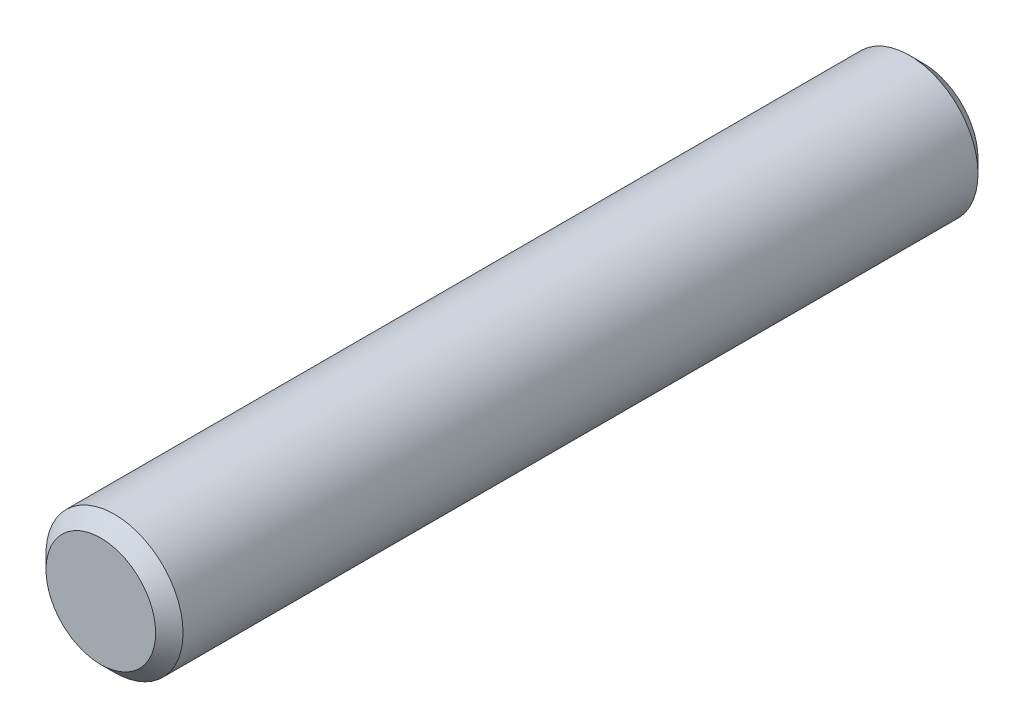
ISO-10303-21;
HEADER;
FILE_DESCRIPTION(('STEP AP214'),'2;1');
FILE_NAME('part.step','',(''),(''),'','','');
FILE_SCHEMA(('AUTOMOTIVE_DESIGN { 1 0 10303 214 1 1 1 1 }'));
ENDSEC;
DATA;
#1=APPLICATION_CONTEXT('core data for automotive mechanical design processes');
#2=APPLICATION_PROTOCOL_DEFINITION('international standard','automotive_design',2000,#1);
#3=PRODUCT_CONTEXT('',#1,'mechanical');
#4=PRODUCT('Part','Part','',(#3));
#5=PRODUCT_RELATED_PRODUCT_CATEGORY('part','',(#4));
#6=PRODUCT_DEFINITION_FORMATION('','',#4);
#7=PRODUCT_DEFINITION_CONTEXT('part definition',#1,'design');
#8=PRODUCT_DEFINITION('design','',#6,#7);
#9=PRODUCT_DEFINITION_SHAPE('','',#8);
#10=(LENGTH_UNIT() NAMED_UNIT(*) SI_UNIT(.MILLI.,.METRE.));
#11=(NAMED_UNIT(*) PLANE_ANGLE_UNIT() SI_UNIT($,.RADIAN.));
#12=(NAMED_UNIT(*) SI_UNIT($,.STERADIAN.) SOLID_ANGLE_UNIT());
#13=UNCERTAINTY_MEASURE_WITH_UNIT(LENGTH_MEASURE(1.E-05),#10,'distance_accuracy_value','');
#14=(GEOMETRIC_REPRESENTATION_CONTEXT(3) GLOBAL_UNCERTAINTY_ASSIGNED_CONTEXT((#13)) GLOBAL_UNIT_ASSIGNED_CONTEXT((#10,
#11,#12)) REPRESENTATION_CONTEXT('',''));
#15=CARTESIAN_POINT('',(0.,0.,0.));
#16=DIRECTION('',(0.,0.,1.));
#17=DIRECTION('',(1.,0.,0.));
#18=AXIS2_PLACEMENT_3D('',#15,#16,#17);
#19=CARTESIAN_POINT('',(0.,0.,15.));
#20=DIRECTION('',(0.,0.,-1.));
#21=DIRECTION('',(-1.,0.,0.));
#22=AXIS2_PLACEMENT_3D('',#19,#20,#21);
#23=CYLINDRICAL_SURFACE('',#22,2.5);
#24=CARTESIAN_POINT('',(0.,0.,-14.5));
#25=DIRECTION('',(0.,0.,1.));
#26=DIRECTION('',(1.,0.,0.));
#27=AXIS2_PLACEMENT_3D('',#24,#25,#26);
#28=CIRCLE('',#27,2.5);
#29=CARTESIAN_POINT('',(2.5,0.,-14.5));
#30=VERTEX_POINT('',#29);
#31=EDGE_CURVE('E45',#30,#30,#28,.T.);
#32=ORIENTED_EDGE('',*,*,#31,.T.);
#33=EDGE_LOOP('',(#32));
#34=FACE_BOUND('',#33,.T.);
#35=CARTESIAN_POINT('',(0.,0.,14.5));
#36=DIRECTION('',(0.,0.,1.));
#37=DIRECTION('',(1.,0.,0.));
#38=AXIS2_PLACEMENT_3D('',#35,#36,#37);
#39=CIRCLE('',#38,2.5);
#40=CARTESIAN_POINT('',(2.5,0.,14.5));
#41=VERTEX_POINT('',#40);
#42=EDGE_CURVE('E49',#41,#41,#39,.F.);
#43=ORIENTED_EDGE('',*,*,#42,.T.);
#44=EDGE_LOOP('',(#43));
#45=FACE_BOUND('',#44,.T.);
#46=ADVANCED_FACE('F34',(#34,#45),#23,.T.);
#47=CARTESIAN_POINT('',(0.,0.,15.));
#48=DIRECTION('',(0.,0.,1.));
#49=DIRECTION('',(1.,0.,0.));
#50=AXIS2_PLACEMENT_3D('',#47,#48,#49);
#51=PLANE('',#50);
#52=CARTESIAN_POINT('',(0.,0.,15.));
#53=DIRECTION('',(0.,0.,1.));
#54=DIRECTION('',(1.,0.,0.));
#55=AXIS2_PLACEMENT_3D('',#52,#53,#54);
#56=CIRCLE('',#55,2.);
#57=CARTESIAN_POINT('',(2.,0.,15.));
#58=VERTEX_POINT('',#57);
#59=EDGE_CURVE('E10',#58,#58,#56,.T.);
#60=ORIENTED_EDGE('',*,*,#59,.T.);
#61=EDGE_LOOP('',(#60));
#62=FACE_BOUND('',#61,.T.);
#63=ADVANCED_FACE('F65',(#62),#51,.T.);
#64=CARTESIAN_POINT('',(0.,0.,-15.));
#65=DIRECTION('',(0.,0.,1.));
#66=DIRECTION('',(1.,0.,0.));
#67=AXIS2_PLACEMENT_3D('',#64,#65,#66);
#68=PLANE('',#67);
#69=CARTESIAN_POINT('',(0.,0.,-15.));
#70=DIRECTION('',(0.,0.,1.));
#71=DIRECTION('',(1.,0.,0.));
#72=AXIS2_PLACEMENT_3D('',#69,#70,#71);
#73=CIRCLE('',#72,2.);
#74=CARTESIAN_POINT('',(2.,0.,-15.));
#75=VERTEX_POINT('',#74);
#76=EDGE_CURVE('E41',#75,#75,#73,.F.);
#77=ORIENTED_EDGE('',*,*,#76,.T.);
#78=EDGE_LOOP('',(#77));
#79=FACE_BOUND('',#78,.T.);
#80=ADVANCED_FACE('F62',(#79),#68,.F.);
#81=CARTESIAN_POINT('',(0.,0.,-14.5));
#82=DIRECTION('',(0.,0.,1.));
#83=DIRECTION('',(1.,0.,0.));
#84=AXIS2_PLACEMENT_3D('',#81,#82,#83);
#85=CONICAL_SURFACE('',#84,2.5,0.785398163397446);
#86=ORIENTED_EDGE('',*,*,#76,.F.);
#87=EDGE_LOOP('',(#86));
#88=FACE_BOUND('',#87,.T.);
#89=ORIENTED_EDGE('',*,*,#31,.F.);
#90=EDGE_LOOP('',(#89));
#91=FACE_BOUND('',#90,.T.);
#92=ADVANCED_FACE('F58',(#88,#91),#85,.T.);
#93=CARTESIAN_POINT('',(0.,0.,15.));
#94=DIRECTION('',(0.,0.,-1.));
#95=DIRECTION('',(-1.,0.,0.));
#96=AXIS2_PLACEMENT_3D('',#93,#94,#95);
#97=CONICAL_SURFACE('',#96,2.,0.785398163397443);
#98=ORIENTED_EDGE('',*,*,#42,.F.);
#99=EDGE_LOOP('',(#98));
#100=FACE_BOUND('',#99,.T.);
#101=ORIENTED_EDGE('',*,*,#59,.F.);
#102=EDGE_LOOP('',(#101));
#103=FACE_BOUND('',#102,.T.);
#104=ADVANCED_FACE('F36',(#100,#103),#97,.T.);
#105=CLOSED_SHELL('',(#46,#63,#80,#92,#104));
#106=MANIFOLD_SOLID_BREP('B2',#105);
#107=ADVANCED_BREP_SHAPE_REPRESENTATION('',(#18,#106),#14);
#108=SHAPE_DEFINITION_REPRESENTATION(#9,#107);
ENDSEC;
END-ISO-10303-21;
